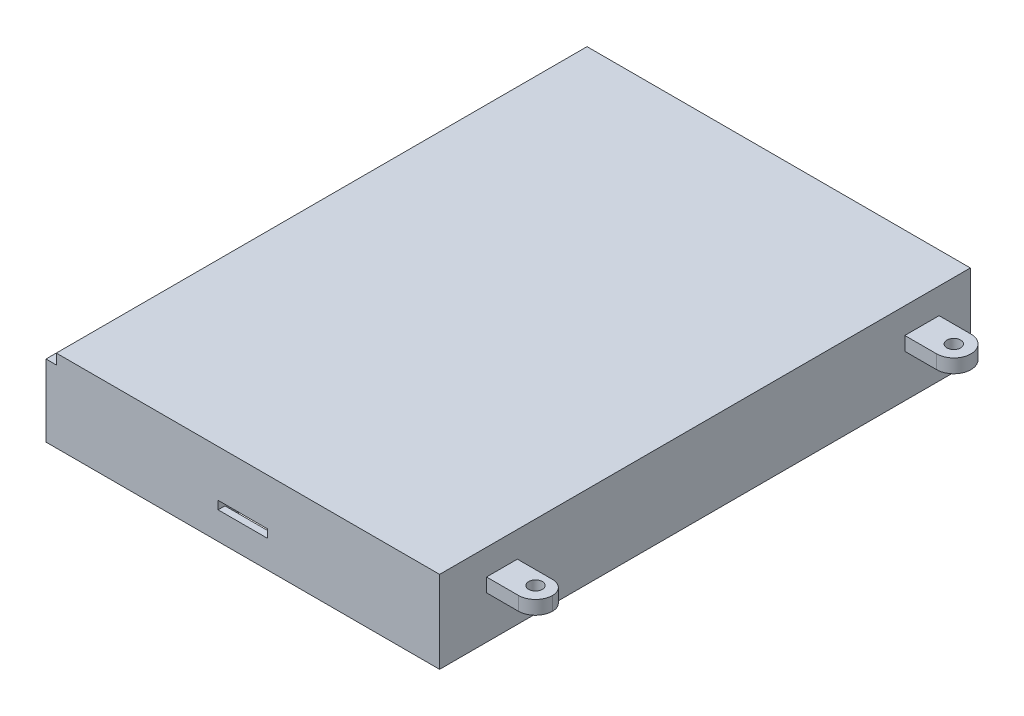
ISO-10303-21;
HEADER;
FILE_DESCRIPTION(('STEP AP214'),'2;1');
FILE_NAME('part.step','',(''),(''),'','','');
FILE_SCHEMA(('AUTOMOTIVE_DESIGN { 1 0 10303 214 1 1 1 1 }'));
ENDSEC;
DATA;
#1=APPLICATION_CONTEXT('core data for automotive mechanical design processes');
#2=APPLICATION_PROTOCOL_DEFINITION('international standard','automotive_design',2000,#1);
#3=PRODUCT_CONTEXT('',#1,'mechanical');
#4=PRODUCT('Part','Part','',(#3));
#5=PRODUCT_RELATED_PRODUCT_CATEGORY('part','',(#4));
#6=PRODUCT_DEFINITION_FORMATION('','',#4);
#7=PRODUCT_DEFINITION_CONTEXT('part definition',#1,'design');
#8=PRODUCT_DEFINITION('design','',#6,#7);
#9=PRODUCT_DEFINITION_SHAPE('','',#8);
#10=(LENGTH_UNIT() NAMED_UNIT(*) SI_UNIT(.MILLI.,.METRE.));
#11=(NAMED_UNIT(*) PLANE_ANGLE_UNIT() SI_UNIT($,.RADIAN.));
#12=(NAMED_UNIT(*) SI_UNIT($,.STERADIAN.) SOLID_ANGLE_UNIT());
#13=UNCERTAINTY_MEASURE_WITH_UNIT(LENGTH_MEASURE(1.E-05),#10,'distance_accuracy_value','');
#14=(GEOMETRIC_REPRESENTATION_CONTEXT(3) GLOBAL_UNCERTAINTY_ASSIGNED_CONTEXT((#13)) GLOBAL_UNIT_ASSIGNED_CONTEXT((#10,
#11,#12)) REPRESENTATION_CONTEXT('',''));
#15=CARTESIAN_POINT('',(0.,0.,0.));
#16=DIRECTION('',(0.,0.,1.));
#17=DIRECTION('',(1.,0.,0.));
#18=AXIS2_PLACEMENT_3D('',#15,#16,#17);
#19=CARTESIAN_POINT('',(26.0779097266843,5.,-34.7));
#20=DIRECTION('',(0.,0.,1.));
#21=DIRECTION('',(1.,0.,0.));
#22=AXIS2_PLACEMENT_3D('',#19,#20,#21);
#23=PLANE('',#22);
#24=DIRECTION('',(0.,1.,0.));
#25=VECTOR('',#24,1.);
#26=CARTESIAN_POINT('',(0.0779097266842485,5.,-34.7));
#27=LINE('',#26,#25);
#28=CARTESIAN_POINT('',(0.0779097266842476,-2.,-34.7));
#29=VERTEX_POINT('',#28);
#30=CARTESIAN_POINT('',(0.0779097266842476,-0.8,-34.7));
#31=VERTEX_POINT('',#30);
#32=EDGE_CURVE('E290',#29,#31,#27,.T.);
#33=ORIENTED_EDGE('',*,*,#32,.T.);
#34=DIRECTION('',(-1.,0.,0.));
#35=VECTOR('',#34,1.);
#36=CARTESIAN_POINT('',(26.0779097266843,-0.8,-34.7));
#37=LINE('',#36,#35);
#38=CARTESIAN_POINT('',(-7.12209027331575,-0.8,-34.7));
#39=VERTEX_POINT('',#38);
#40=EDGE_CURVE('E300',#31,#39,#37,.T.);
#41=ORIENTED_EDGE('',*,*,#40,.T.);
#42=DIRECTION('',(0.,-1.,0.));
#43=VECTOR('',#42,1.);
#44=CARTESIAN_POINT('',(-7.12209027331575,5.,-34.7));
#45=LINE('',#44,#43);
#46=CARTESIAN_POINT('',(-7.12209027331575,-2.,-34.7));
#47=VERTEX_POINT('',#46);
#48=EDGE_CURVE('E287',#39,#47,#45,.T.);
#49=ORIENTED_EDGE('',*,*,#48,.T.);
#50=DIRECTION('',(1.,0.,0.));
#51=VECTOR('',#50,1.);
#52=CARTESIAN_POINT('',(26.0779097266843,-2.,-34.7));
#53=LINE('',#52,#51);
#54=EDGE_CURVE('E297',#47,#29,#53,.T.);
#55=ORIENTED_EDGE('',*,*,#54,.T.);
#56=EDGE_LOOP('',(#33,#41,#49,#55));
#57=FACE_BOUND('',#56,.T.);
#58=DIRECTION('',(-1.,0.,0.));
#59=VECTOR('',#58,1.);
#60=CARTESIAN_POINT('',(0.,4.5,-34.7));
#61=LINE('',#60,#59);
#62=CARTESIAN_POINT('',(-30.7220902733158,4.5,-34.7));
#63=VERTEX_POINT('',#62);
#64=CARTESIAN_POINT('',(-32.2220902733158,4.5,-34.7));
#65=VERTEX_POINT('',#64);
#66=EDGE_CURVE('E342',#63,#65,#61,.T.);
#67=ORIENTED_EDGE('',*,*,#66,.F.);
#68=DIRECTION('',(0.,1.,0.));
#69=VECTOR('',#68,1.);
#70=CARTESIAN_POINT('',(-30.7220902733158,5.,-34.7));
#71=LINE('',#70,#69);
#72=CARTESIAN_POINT('',(-30.7220902733158,6.,-34.7));
#73=VERTEX_POINT('',#72);
#74=EDGE_CURVE('E348',#63,#73,#71,.T.);
#75=ORIENTED_EDGE('',*,*,#74,.T.);
#76=DIRECTION('',(-1.,0.,0.));
#77=VECTOR('',#76,1.);
#78=CARTESIAN_POINT('',(26.0779097266843,6.,-34.7));
#79=LINE('',#78,#77);
#80=CARTESIAN_POINT('',(25.1779097266842,6.,-34.7));
#81=VERTEX_POINT('',#80);
#82=EDGE_CURVE('E364',#81,#73,#79,.T.);
#83=ORIENTED_EDGE('',*,*,#82,.F.);
#84=DIRECTION('',(0.,-1.,0.));
#85=VECTOR('',#84,1.);
#86=CARTESIAN_POINT('',(25.1779097266842,5.,-34.7));
#87=LINE('',#86,#85);
#88=CARTESIAN_POINT('',(25.1779097266842,-6.,-34.7));
#89=VERTEX_POINT('',#88);
#90=EDGE_CURVE('E411',#81,#89,#87,.T.);
#91=ORIENTED_EDGE('',*,*,#90,.T.);
#92=DIRECTION('',(1.,0.,0.));
#93=VECTOR('',#92,1.);
#94=CARTESIAN_POINT('',(26.0779097266843,-6.,-34.7));
#95=LINE('',#94,#93);
#96=CARTESIAN_POINT('',(-32.2220902733158,-6.,-34.7));
#97=VERTEX_POINT('',#96);
#98=EDGE_CURVE('E357',#97,#89,#95,.T.);
#99=ORIENTED_EDGE('',*,*,#98,.F.);
#100=DIRECTION('',(0.,-1.,0.));
#101=VECTOR('',#100,1.);
#102=CARTESIAN_POINT('',(-32.2220902733158,5.,-34.7));
#103=LINE('',#102,#101);
#104=EDGE_CURVE('E487',#65,#97,#103,.T.);
#105=ORIENTED_EDGE('',*,*,#104,.F.);
#106=EDGE_LOOP('',(#67,#75,#83,#91,#99,#105));
#107=FACE_BOUND('',#106,.T.);
#108=ADVANCED_FACE('F45',(#57,#107),#23,.F.);
#109=CARTESIAN_POINT('',(-32.2220902733158,5.,-37.2));
#110=DIRECTION('',(1.,0.,0.));
#111=DIRECTION('',(0.,0.,-1.));
#112=AXIS2_PLACEMENT_3D('',#109,#110,#111);
#113=PLANE('',#112);
#114=DIRECTION('',(0.,-1.,0.));
#115=VECTOR('',#114,1.);
#116=CARTESIAN_POINT('',(-32.2220902733158,5.,42.7));
#117=LINE('',#116,#115);
#118=CARTESIAN_POINT('',(-32.2220902733158,4.5,42.7));
#119=VERTEX_POINT('',#118);
#120=CARTESIAN_POINT('',(-32.2220902733158,-6.,42.7));
#121=VERTEX_POINT('',#120);
#122=EDGE_CURVE('E489',#119,#121,#117,.T.);
#123=ORIENTED_EDGE('',*,*,#122,.F.);
#124=DIRECTION('',(0.,0.,1.));
#125=VECTOR('',#124,1.);
#126=CARTESIAN_POINT('',(-32.2220902733158,4.5,-32.7));
#127=LINE('',#126,#125);
#128=EDGE_CURVE('E336',#65,#119,#127,.T.);
#129=ORIENTED_EDGE('',*,*,#128,.F.);
#130=ORIENTED_EDGE('',*,*,#104,.T.);
#131=DIRECTION('',(0.,0.,-1.));
#132=VECTOR('',#131,1.);
#133=CARTESIAN_POINT('',(-32.2220902733158,-6.,40.7));
#134=LINE('',#133,#132);
#135=EDGE_CURVE('E354',#121,#97,#134,.T.);
#136=ORIENTED_EDGE('',*,*,#135,.F.);
#137=EDGE_LOOP('',(#123,#129,#130,#136));
#138=FACE_BOUND('',#137,.T.);
#139=ADVANCED_FACE('F548',(#138),#113,.F.);
#140=CARTESIAN_POINT('',(-32.3220902733158,5.,42.7));
#141=DIRECTION('',(0.,0.,-1.));
#142=DIRECTION('',(-1.,0.,0.));
#143=AXIS2_PLACEMENT_3D('',#140,#141,#142);
#144=PLANE('',#143);
#145=DIRECTION('',(0.,-1.,0.));
#146=VECTOR('',#145,1.);
#147=CARTESIAN_POINT('',(-7.12209027331575,-0.8,42.7));
#148=LINE('',#147,#146);
#149=CARTESIAN_POINT('',(-7.12209027331575,-0.8,42.7));
#150=VERTEX_POINT('',#149);
#151=CARTESIAN_POINT('',(-7.12209027331575,-2.,42.7));
#152=VERTEX_POINT('',#151);
#153=EDGE_CURVE('E272',#150,#152,#148,.T.);
#154=ORIENTED_EDGE('',*,*,#153,.F.);
#155=DIRECTION('',(-1.,0.,0.));
#156=VECTOR('',#155,1.);
#157=CARTESIAN_POINT('',(0.0779097266842476,-0.8,42.7));
#158=LINE('',#157,#156);
#159=CARTESIAN_POINT('',(0.0779097266842476,-0.8,42.7));
#160=VERTEX_POINT('',#159);
#161=EDGE_CURVE('E276',#160,#150,#158,.T.);
#162=ORIENTED_EDGE('',*,*,#161,.F.);
#163=DIRECTION('',(0.,1.,0.));
#164=VECTOR('',#163,1.);
#165=CARTESIAN_POINT('',(0.0779097266842476,-2.,42.7));
#166=LINE('',#165,#164);
#167=CARTESIAN_POINT('',(0.0779097266842476,-2.,42.7));
#168=VERTEX_POINT('',#167);
#169=EDGE_CURVE('E269',#168,#160,#166,.T.);
#170=ORIENTED_EDGE('',*,*,#169,.F.);
#171=DIRECTION('',(1.,0.,0.));
#172=VECTOR('',#171,1.);
#173=CARTESIAN_POINT('',(-7.12209027331575,-2.,42.7));
#174=LINE('',#173,#172);
#175=EDGE_CURVE('E264',#152,#168,#174,.T.);
#176=ORIENTED_EDGE('',*,*,#175,.F.);
#177=EDGE_LOOP('',(#154,#162,#170,#176));
#178=FACE_BOUND('',#177,.T.);
#179=DIRECTION('',(1.,0.,0.));
#180=VECTOR('',#179,1.);
#181=CARTESIAN_POINT('',(-32.3220902733158,6.,42.7));
#182=LINE('',#181,#180);
#183=CARTESIAN_POINT('',(-30.7220902733157,6.,42.7));
#184=VERTEX_POINT('',#183);
#185=CARTESIAN_POINT('',(25.1779097266842,6.,42.7));
#186=VERTEX_POINT('',#185);
#187=EDGE_CURVE('E365',#184,#186,#182,.T.);
#188=ORIENTED_EDGE('',*,*,#187,.F.);
#189=DIRECTION('',(0.,1.,0.));
#190=VECTOR('',#189,1.);
#191=CARTESIAN_POINT('',(-30.7220902733157,4.5,42.7));
#192=LINE('',#191,#190);
#193=CARTESIAN_POINT('',(-30.7220902733157,4.5,42.7));
#194=VERTEX_POINT('',#193);
#195=EDGE_CURVE('E486',#194,#184,#192,.T.);
#196=ORIENTED_EDGE('',*,*,#195,.F.);
#197=DIRECTION('',(1.,0.,0.));
#198=VECTOR('',#197,1.);
#199=CARTESIAN_POINT('',(0.,4.5,42.7));
#200=LINE('',#199,#198);
#201=EDGE_CURVE('E338',#119,#194,#200,.T.);
#202=ORIENTED_EDGE('',*,*,#201,.F.);
#203=ORIENTED_EDGE('',*,*,#122,.T.);
#204=DIRECTION('',(-1.,0.,0.));
#205=VECTOR('',#204,1.);
#206=CARTESIAN_POINT('',(-32.3220902733158,-6.,42.7));
#207=LINE('',#206,#205);
#208=CARTESIAN_POINT('',(25.1779097266842,-6.,42.7));
#209=VERTEX_POINT('',#208);
#210=EDGE_CURVE('E360',#209,#121,#207,.T.);
#211=ORIENTED_EDGE('',*,*,#210,.F.);
#212=DIRECTION('',(0.,-1.,0.));
#213=VECTOR('',#212,1.);
#214=CARTESIAN_POINT('',(25.1779097266842,5.,42.7));
#215=LINE('',#214,#213);
#216=EDGE_CURVE('E417',#186,#209,#215,.T.);
#217=ORIENTED_EDGE('',*,*,#216,.F.);
#218=EDGE_LOOP('',(#188,#196,#202,#203,#211,#217));
#219=FACE_BOUND('',#218,.T.);
#220=ADVANCED_FACE('F47',(#178,#219),#144,.F.);
#221=CARTESIAN_POINT('',(25.1779097266842,5.,37.2));
#222=DIRECTION('',(-1.,0.,0.));
#223=DIRECTION('',(0.,0.,1.));
#224=AXIS2_PLACEMENT_3D('',#221,#222,#223);
#225=PLANE('',#224);
#226=DIRECTION('',(0.,0.,-1.));
#227=VECTOR('',#226,1.);
#228=CARTESIAN_POINT('',(25.1779097266842,0.25,66.));
#229=LINE('',#228,#227);
#230=CARTESIAN_POINT('',(25.1779097266842,0.25,-25.1415528323985));
#231=VERTEX_POINT('',#230);
#232=CARTESIAN_POINT('',(25.1779097266842,0.25,-30.1415528323985));
#233=VERTEX_POINT('',#232);
#234=EDGE_CURVE('E368',#231,#233,#229,.T.);
#235=ORIENTED_EDGE('',*,*,#234,.F.);
#236=DIRECTION('',(0.,-1.,0.));
#237=VECTOR('',#236,1.);
#238=CARTESIAN_POINT('',(25.1779097266842,5.,-25.1415528323985));
#239=LINE('',#238,#237);
#240=CARTESIAN_POINT('',(25.1779097266842,2.25,-25.1415528323985));
#241=VERTEX_POINT('',#240);
#242=EDGE_CURVE('E382',#241,#231,#239,.T.);
#243=ORIENTED_EDGE('',*,*,#242,.F.);
#244=DIRECTION('',(0.,0.,1.));
#245=VECTOR('',#244,1.);
#246=CARTESIAN_POINT('',(25.1779097266842,2.25,37.2));
#247=LINE('',#246,#245);
#248=CARTESIAN_POINT('',(25.1779097266842,2.25,-30.1415528323985));
#249=VERTEX_POINT('',#248);
#250=EDGE_CURVE('E459',#249,#241,#247,.T.);
#251=ORIENTED_EDGE('',*,*,#250,.F.);
#252=DIRECTION('',(0.,-1.,0.));
#253=VECTOR('',#252,1.);
#254=CARTESIAN_POINT('',(25.1779097266842,5.,-30.1415528323985));
#255=LINE('',#254,#253);
#256=EDGE_CURVE('E379',#249,#233,#255,.T.);
#257=ORIENTED_EDGE('',*,*,#256,.T.);
#258=EDGE_LOOP('',(#235,#243,#251,#257));
#259=FACE_BOUND('',#258,.T.);
#260=DIRECTION('',(0.,1.,0.));
#261=VECTOR('',#260,1.);
#262=CARTESIAN_POINT('',(25.1779097266842,-2.,31.3584471676015));
#263=LINE('',#262,#261);
#264=CARTESIAN_POINT('',(25.1779097266842,0.25,31.3584471676015));
#265=VERTEX_POINT('',#264);
#266=CARTESIAN_POINT('',(25.1779097266842,2.25,31.3584471676015));
#267=VERTEX_POINT('',#266);
#268=EDGE_CURVE('E366',#265,#267,#263,.T.);
#269=ORIENTED_EDGE('',*,*,#268,.F.);
#270=DIRECTION('',(0.,0.,-1.));
#271=VECTOR('',#270,1.);
#272=CARTESIAN_POINT('',(25.1779097266842,0.25,66.));
#273=LINE('',#272,#271);
#274=CARTESIAN_POINT('',(25.1779097266842,0.25,35.8584471676015));
#275=VERTEX_POINT('',#274);
#276=EDGE_CURVE('E445',#275,#265,#273,.T.);
#277=ORIENTED_EDGE('',*,*,#276,.F.);
#278=DIRECTION('',(0.,-1.,0.));
#279=VECTOR('',#278,1.);
#280=CARTESIAN_POINT('',(25.1779097266842,5.,35.8584471676015));
#281=LINE('',#280,#279);
#282=CARTESIAN_POINT('',(25.1779097266842,2.25,35.8584471676015));
#283=VERTEX_POINT('',#282);
#284=EDGE_CURVE('E373',#283,#275,#281,.T.);
#285=ORIENTED_EDGE('',*,*,#284,.F.);
#286=DIRECTION('',(0.,0.,1.));
#287=VECTOR('',#286,1.);
#288=CARTESIAN_POINT('',(25.1779097266842,2.25,37.2));
#289=LINE('',#288,#287);
#290=EDGE_CURVE('E465',#267,#283,#289,.T.);
#291=ORIENTED_EDGE('',*,*,#290,.F.);
#292=EDGE_LOOP('',(#269,#277,#285,#291));
#293=FACE_BOUND('',#292,.T.);
#294=DIRECTION('',(0.,0.,1.));
#295=VECTOR('',#294,1.);
#296=CARTESIAN_POINT('',(25.1779097266842,-6.,40.7));
#297=LINE('',#296,#295);
#298=EDGE_CURVE('E358',#89,#209,#297,.T.);
#299=ORIENTED_EDGE('',*,*,#298,.F.);
#300=ORIENTED_EDGE('',*,*,#90,.F.);
#301=DIRECTION('',(0.,0.,-1.));
#302=VECTOR('',#301,1.);
#303=CARTESIAN_POINT('',(25.1779097266842,6.,-32.7));
#304=LINE('',#303,#302);
#305=EDGE_CURVE('E361',#186,#81,#304,.T.);
#306=ORIENTED_EDGE('',*,*,#305,.F.);
#307=ORIENTED_EDGE('',*,*,#216,.T.);
#308=EDGE_LOOP('',(#299,#300,#306,#307));
#309=FACE_BOUND('',#308,.T.);
#310=ADVANCED_FACE('F576',(#259,#293,#309),#225,.F.);
#311=CARTESIAN_POINT('',(29.8220902733158,5.,-25.1415528323985));
#312=DIRECTION('',(0.,0.,-1.));
#313=DIRECTION('',(-1.,0.,0.));
#314=AXIS2_PLACEMENT_3D('',#311,#312,#313);
#315=PLANE('',#314);
#316=DIRECTION('',(-1.,0.,0.));
#317=VECTOR('',#316,1.);
#318=CARTESIAN_POINT('',(29.8220902733158,0.25,-25.1415528323985));
#319=LINE('',#318,#317);
#320=CARTESIAN_POINT('',(29.8220902733158,0.25,-25.1415528323985));
#321=VERTEX_POINT('',#320);
#322=EDGE_CURVE('E436',#321,#231,#319,.T.);
#323=ORIENTED_EDGE('',*,*,#322,.F.);
#324=DIRECTION('',(0.,-1.,0.));
#325=VECTOR('',#324,1.);
#326=CARTESIAN_POINT('',(29.8220902733158,5.,-25.1415528323985));
#327=LINE('',#326,#325);
#328=CARTESIAN_POINT('',(29.8220902733158,2.25,-25.1415528323985));
#329=VERTEX_POINT('',#328);
#330=EDGE_CURVE('E378',#329,#321,#327,.T.);
#331=ORIENTED_EDGE('',*,*,#330,.F.);
#332=DIRECTION('',(-1.,0.,0.));
#333=VECTOR('',#332,1.);
#334=CARTESIAN_POINT('',(29.8220902733158,2.25,-25.1415528323985));
#335=LINE('',#334,#333);
#336=EDGE_CURVE('E405',#329,#241,#335,.T.);
#337=ORIENTED_EDGE('',*,*,#336,.T.);
#338=ORIENTED_EDGE('',*,*,#242,.T.);
#339=EDGE_LOOP('',(#323,#331,#337,#338));
#340=FACE_BOUND('',#339,.T.);
#341=ADVANCED_FACE('F578',(#340),#315,.F.);
#342=CARTESIAN_POINT('',(29.8220902733158,5.,-27.6415528323985));
#343=DIRECTION('',(0.,-1.,0.));
#344=DIRECTION('',(0.,0.,-1.));
#345=AXIS2_PLACEMENT_3D('',#342,#343,#344);
#346=CYLINDRICAL_SURFACE('',#345,2.5);
#347=CARTESIAN_POINT('',(29.8220902733158,0.25,-27.6415528323985));
#348=DIRECTION('',(0.,-1.,0.));
#349=DIRECTION('',(0.,0.,-1.));
#350=AXIS2_PLACEMENT_3D('',#347,#348,#349);
#351=CIRCLE('',#350,2.5);
#352=CARTESIAN_POINT('',(29.8220902733158,0.25,-30.1415528323985));
#353=VERTEX_POINT('',#352);
#354=EDGE_CURVE('E439',#353,#321,#351,.T.);
#355=ORIENTED_EDGE('',*,*,#354,.F.);
#356=DIRECTION('',(0.,-1.,0.));
#357=VECTOR('',#356,1.);
#358=CARTESIAN_POINT('',(29.8220902733158,5.,-30.1415528323985));
#359=LINE('',#358,#357);
#360=CARTESIAN_POINT('',(29.8220902733158,2.25,-30.1415528323985));
#361=VERTEX_POINT('',#360);
#362=EDGE_CURVE('E375',#361,#353,#359,.T.);
#363=ORIENTED_EDGE('',*,*,#362,.F.);
#364=CARTESIAN_POINT('',(29.8220902733158,2.25,-27.6415528323985));
#365=DIRECTION('',(0.,-1.,0.));
#366=DIRECTION('',(0.,0.,-1.));
#367=AXIS2_PLACEMENT_3D('',#364,#365,#366);
#368=CIRCLE('',#367,2.5);
#369=EDGE_CURVE('E472',#361,#329,#368,.T.);
#370=ORIENTED_EDGE('',*,*,#369,.T.);
#371=ORIENTED_EDGE('',*,*,#330,.T.);
#372=EDGE_LOOP('',(#355,#363,#370,#371));
#373=FACE_BOUND('',#372,.T.);
#374=ADVANCED_FACE('F598',(#373),#346,.T.);
#375=CARTESIAN_POINT('',(29.8220902733158,5.,-30.1415528323985));
#376=DIRECTION('',(0.,0.,1.));
#377=DIRECTION('',(1.,0.,0.));
#378=AXIS2_PLACEMENT_3D('',#375,#376,#377);
#379=PLANE('',#378);
#380=DIRECTION('',(1.,0.,0.));
#381=VECTOR('',#380,1.);
#382=CARTESIAN_POINT('',(29.8220902733158,0.25,-30.1415528323985));
#383=LINE('',#382,#381);
#384=EDGE_CURVE('E441',#233,#353,#383,.T.);
#385=ORIENTED_EDGE('',*,*,#384,.F.);
#386=ORIENTED_EDGE('',*,*,#256,.F.);
#387=DIRECTION('',(1.,0.,0.));
#388=VECTOR('',#387,1.);
#389=CARTESIAN_POINT('',(29.8220902733158,2.25,-30.1415528323985));
#390=LINE('',#389,#388);
#391=EDGE_CURVE('E462',#249,#361,#390,.T.);
#392=ORIENTED_EDGE('',*,*,#391,.T.);
#393=ORIENTED_EDGE('',*,*,#362,.T.);
#394=EDGE_LOOP('',(#385,#386,#392,#393));
#395=FACE_BOUND('',#394,.T.);
#396=ADVANCED_FACE('F602',(#395),#379,.F.);
#397=CARTESIAN_POINT('',(29.8220902733158,5.,35.8584471676015));
#398=DIRECTION('',(0.,0.,-1.));
#399=DIRECTION('',(-1.,0.,0.));
#400=AXIS2_PLACEMENT_3D('',#397,#398,#399);
#401=PLANE('',#400);
#402=DIRECTION('',(-1.,0.,0.));
#403=VECTOR('',#402,1.);
#404=CARTESIAN_POINT('',(29.8220902733158,0.25,35.8584471676015));
#405=LINE('',#404,#403);
#406=CARTESIAN_POINT('',(29.8220902733158,0.25,35.8584471676015));
#407=VERTEX_POINT('',#406);
#408=EDGE_CURVE('E443',#407,#275,#405,.T.);
#409=ORIENTED_EDGE('',*,*,#408,.F.);
#410=DIRECTION('',(0.,-1.,0.));
#411=VECTOR('',#410,1.);
#412=CARTESIAN_POINT('',(29.8220902733158,5.,35.8584471676015));
#413=LINE('',#412,#411);
#414=CARTESIAN_POINT('',(29.8220902733158,2.25,35.8584471676015));
#415=VERTEX_POINT('',#414);
#416=EDGE_CURVE('E370',#415,#407,#413,.T.);
#417=ORIENTED_EDGE('',*,*,#416,.F.);
#418=DIRECTION('',(1.,0.,0.));
#419=VECTOR('',#418,1.);
#420=CARTESIAN_POINT('',(26.0779097266843,2.25,35.8584471676015));
#421=LINE('',#420,#419);
#422=EDGE_CURVE('E438',#283,#415,#421,.T.);
#423=ORIENTED_EDGE('',*,*,#422,.F.);
#424=ORIENTED_EDGE('',*,*,#284,.T.);
#425=EDGE_LOOP('',(#409,#417,#423,#424));
#426=FACE_BOUND('',#425,.T.);
#427=ADVANCED_FACE('F606',(#426),#401,.F.);
#428=CARTESIAN_POINT('',(29.8220902733158,5.,33.3584471676015));
#429=DIRECTION('',(0.,-1.,0.));
#430=DIRECTION('',(0.,0.,-1.));
#431=AXIS2_PLACEMENT_3D('',#428,#429,#430);
#432=CYLINDRICAL_SURFACE('',#431,2.5);
#433=CARTESIAN_POINT('',(29.8220902733158,0.25,33.3584471676015));
#434=DIRECTION('',(0.,-1.,0.));
#435=DIRECTION('',(0.,0.,-1.));
#436=AXIS2_PLACEMENT_3D('',#433,#434,#435);
#437=CIRCLE('',#436,2.5);
#438=CARTESIAN_POINT('',(32.3220902733158,0.25,33.3584471676015));
#439=VERTEX_POINT('',#438);
#440=EDGE_CURVE('E434',#439,#407,#437,.T.);
#441=ORIENTED_EDGE('',*,*,#440,.F.);
#442=DIRECTION('',(0.,-1.,0.));
#443=VECTOR('',#442,1.);
#444=CARTESIAN_POINT('',(32.3220902733158,5.,33.3584471676015));
#445=LINE('',#444,#443);
#446=CARTESIAN_POINT('',(32.3220902733158,2.25,33.3584471676015));
#447=VERTEX_POINT('',#446);
#448=EDGE_CURVE('E418',#439,#447,#445,.F.);
#449=ORIENTED_EDGE('',*,*,#448,.T.);
#450=CARTESIAN_POINT('',(29.8220902733158,2.25,33.3584471676015));
#451=DIRECTION('',(0.,-1.,0.));
#452=DIRECTION('',(0.,0.,-1.));
#453=AXIS2_PLACEMENT_3D('',#450,#451,#452);
#454=CIRCLE('',#453,2.5);
#455=EDGE_CURVE('E460',#447,#415,#454,.T.);
#456=ORIENTED_EDGE('',*,*,#455,.T.);
#457=ORIENTED_EDGE('',*,*,#416,.T.);
#458=EDGE_LOOP('',(#441,#449,#456,#457));
#459=FACE_BOUND('',#458,.T.);
#460=ADVANCED_FACE('F610',(#459),#432,.T.);
#461=CARTESIAN_POINT('',(29.8220902733158,5.,-27.6415528323985));
#462=DIRECTION('',(0.,-1.,0.));
#463=DIRECTION('',(0.,0.,-1.));
#464=AXIS2_PLACEMENT_3D('',#461,#462,#463);
#465=CYLINDRICAL_SURFACE('',#464,0.999999999999997);
#466=CARTESIAN_POINT('',(29.8220902733158,2.25,-27.6415528323985));
#467=DIRECTION('',(0.,-1.,0.));
#468=DIRECTION('',(0.,0.,-1.));
#469=AXIS2_PLACEMENT_3D('',#466,#467,#468);
#470=CIRCLE('',#469,0.999999999999997);
#471=CARTESIAN_POINT('',(29.8220902733158,2.25,-28.6415528323985));
#472=VERTEX_POINT('',#471);
#473=EDGE_CURVE('E458',#472,#472,#470,.T.);
#474=ORIENTED_EDGE('',*,*,#473,.F.);
#475=EDGE_LOOP('',(#474));
#476=FACE_BOUND('',#475,.T.);
#477=CARTESIAN_POINT('',(29.8220902733158,0.25,-27.6415528323985));
#478=DIRECTION('',(0.,-1.,0.));
#479=DIRECTION('',(0.,0.,-1.));
#480=AXIS2_PLACEMENT_3D('',#477,#478,#479);
#481=CIRCLE('',#480,0.999999999999997);
#482=CARTESIAN_POINT('',(29.8220902733158,0.25,-28.6415528323985));
#483=VERTEX_POINT('',#482);
#484=EDGE_CURVE('E431',#483,#483,#481,.T.);
#485=ORIENTED_EDGE('',*,*,#484,.T.);
#486=EDGE_LOOP('',(#485));
#487=FACE_BOUND('',#486,.T.);
#488=ADVANCED_FACE('F614',(#476,#487),#465,.F.);
#489=CARTESIAN_POINT('',(29.8220902733158,5.,33.3584471676015));
#490=DIRECTION('',(0.,-1.,0.));
#491=DIRECTION('',(0.,0.,-1.));
#492=AXIS2_PLACEMENT_3D('',#489,#490,#491);
#493=CYLINDRICAL_SURFACE('',#492,0.999999999999998);
#494=CARTESIAN_POINT('',(29.8220902733158,2.25,33.3584471676015));
#495=DIRECTION('',(0.,-1.,0.));
#496=DIRECTION('',(0.,0.,-1.));
#497=AXIS2_PLACEMENT_3D('',#494,#495,#496);
#498=CIRCLE('',#497,0.999999999999998);
#499=CARTESIAN_POINT('',(29.8220902733158,2.25,32.3584471676015));
#500=VERTEX_POINT('',#499);
#501=EDGE_CURVE('E455',#500,#500,#498,.T.);
#502=ORIENTED_EDGE('',*,*,#501,.F.);
#503=EDGE_LOOP('',(#502));
#504=FACE_BOUND('',#503,.T.);
#505=CARTESIAN_POINT('',(29.8220902733158,0.25,33.3584471676015));
#506=DIRECTION('',(0.,-1.,0.));
#507=DIRECTION('',(0.,0.,-1.));
#508=AXIS2_PLACEMENT_3D('',#505,#506,#507);
#509=CIRCLE('',#508,0.999999999999998);
#510=CARTESIAN_POINT('',(29.8220902733158,0.25,32.3584471676015));
#511=VERTEX_POINT('',#510);
#512=EDGE_CURVE('E435',#511,#511,#509,.T.);
#513=ORIENTED_EDGE('',*,*,#512,.T.);
#514=EDGE_LOOP('',(#513));
#515=FACE_BOUND('',#514,.T.);
#516=ADVANCED_FACE('F563',(#504,#515),#493,.F.);
#517=CARTESIAN_POINT('',(26.0779097266843,2.25,-69.6415528323985));
#518=DIRECTION('',(0.,-1.,0.));
#519=DIRECTION('',(0.,0.,-1.));
#520=AXIS2_PLACEMENT_3D('',#517,#518,#519);
#521=PLANE('',#520);
#522=ORIENTED_EDGE('',*,*,#501,.T.);
#523=EDGE_LOOP('',(#522));
#524=FACE_BOUND('',#523,.T.);
#525=ORIENTED_EDGE('',*,*,#455,.F.);
#526=CARTESIAN_POINT('',(30.3220902733158,2.25,33.3584471676015));
#527=DIRECTION('',(0.,-1.,0.));
#528=DIRECTION('',(0.,0.,-1.));
#529=AXIS2_PLACEMENT_3D('',#526,#527,#528);
#530=CIRCLE('',#529,2.);
#531=CARTESIAN_POINT('',(30.3220902733158,2.25,31.3584471676015));
#532=VERTEX_POINT('',#531);
#533=EDGE_CURVE('E421',#447,#532,#530,.F.);
#534=ORIENTED_EDGE('',*,*,#533,.T.);
#535=DIRECTION('',(1.,0.,0.));
#536=VECTOR('',#535,1.);
#537=CARTESIAN_POINT('',(25.1779097266842,2.25,31.3584471676015));
#538=LINE('',#537,#536);
#539=EDGE_CURVE('E369',#267,#532,#538,.T.);
#540=ORIENTED_EDGE('',*,*,#539,.F.);
#541=ORIENTED_EDGE('',*,*,#290,.T.);
#542=ORIENTED_EDGE('',*,*,#422,.T.);
#543=EDGE_LOOP('',(#525,#534,#540,#541,#542));
#544=FACE_BOUND('',#543,.T.);
#545=ADVANCED_FACE('F559',(#524,#544),#521,.F.);
#546=ORIENTED_EDGE('',*,*,#473,.T.);
#547=EDGE_LOOP('',(#546));
#548=FACE_BOUND('',#547,.T.);
#549=ORIENTED_EDGE('',*,*,#369,.F.);
#550=ORIENTED_EDGE('',*,*,#391,.F.);
#551=ORIENTED_EDGE('',*,*,#250,.T.);
#552=ORIENTED_EDGE('',*,*,#336,.F.);
#553=EDGE_LOOP('',(#549,#550,#551,#552));
#554=FACE_BOUND('',#553,.T.);
#555=ADVANCED_FACE('F562',(#548,#554),#521,.F.);
#556=CARTESIAN_POINT('',(25.1779097266842,0.25,66.));
#557=DIRECTION('',(0.,-1.,0.));
#558=DIRECTION('',(0.,0.,-1.));
#559=AXIS2_PLACEMENT_3D('',#556,#557,#558);
#560=PLANE('',#559);
#561=DIRECTION('',(-1.,0.,0.));
#562=VECTOR('',#561,1.);
#563=CARTESIAN_POINT('',(25.1779097266842,0.25,31.3584471676015));
#564=LINE('',#563,#562);
#565=CARTESIAN_POINT('',(30.3220902733158,0.25,31.3584471676015));
#566=VERTEX_POINT('',#565);
#567=EDGE_CURVE('E414',#566,#265,#564,.T.);
#568=ORIENTED_EDGE('',*,*,#567,.F.);
#569=CARTESIAN_POINT('',(30.3220902733158,0.25,33.3584471676015));
#570=DIRECTION('',(0.,-1.,0.));
#571=DIRECTION('',(0.,0.,-1.));
#572=AXIS2_PLACEMENT_3D('',#569,#570,#571);
#573=CIRCLE('',#572,2.);
#574=EDGE_CURVE('E424',#566,#439,#573,.T.);
#575=ORIENTED_EDGE('',*,*,#574,.T.);
#576=ORIENTED_EDGE('',*,*,#440,.T.);
#577=ORIENTED_EDGE('',*,*,#408,.T.);
#578=ORIENTED_EDGE('',*,*,#276,.T.);
#579=EDGE_LOOP('',(#568,#575,#576,#577,#578));
#580=FACE_BOUND('',#579,.T.);
#581=ORIENTED_EDGE('',*,*,#512,.F.);
#582=EDGE_LOOP('',(#581));
#583=FACE_BOUND('',#582,.T.);
#584=ADVANCED_FACE('F569',(#580,#583),#560,.T.);
#585=ORIENTED_EDGE('',*,*,#484,.F.);
#586=EDGE_LOOP('',(#585));
#587=FACE_BOUND('',#586,.T.);
#588=ORIENTED_EDGE('',*,*,#322,.T.);
#589=ORIENTED_EDGE('',*,*,#234,.T.);
#590=ORIENTED_EDGE('',*,*,#384,.T.);
#591=ORIENTED_EDGE('',*,*,#354,.T.);
#592=EDGE_LOOP('',(#588,#589,#590,#591));
#593=FACE_BOUND('',#592,.T.);
#594=ADVANCED_FACE('F565',(#587,#593),#560,.T.);
#595=CARTESIAN_POINT('',(25.1779097266842,-2.,31.3584471676015));
#596=DIRECTION('',(0.,0.,1.));
#597=DIRECTION('',(1.,0.,0.));
#598=AXIS2_PLACEMENT_3D('',#595,#596,#597);
#599=PLANE('',#598);
#600=ORIENTED_EDGE('',*,*,#539,.T.);
#601=DIRECTION('',(0.,-1.,0.));
#602=VECTOR('',#601,1.);
#603=CARTESIAN_POINT('',(30.3220902733158,-2.,31.3584471676015));
#604=LINE('',#603,#602);
#605=EDGE_CURVE('E422',#532,#566,#604,.T.);
#606=ORIENTED_EDGE('',*,*,#605,.T.);
#607=ORIENTED_EDGE('',*,*,#567,.T.);
#608=ORIENTED_EDGE('',*,*,#268,.T.);
#609=EDGE_LOOP('',(#600,#606,#607,#608));
#610=FACE_BOUND('',#609,.T.);
#611=ADVANCED_FACE('F568',(#610),#599,.F.);
#612=CARTESIAN_POINT('',(30.3220902733158,5.,33.3584471676015));
#613=DIRECTION('',(0.,-1.,0.));
#614=DIRECTION('',(0.,0.,-1.));
#615=AXIS2_PLACEMENT_3D('',#612,#613,#614);
#616=CYLINDRICAL_SURFACE('',#615,2.);
#617=ORIENTED_EDGE('',*,*,#574,.F.);
#618=ORIENTED_EDGE('',*,*,#605,.F.);
#619=ORIENTED_EDGE('',*,*,#533,.F.);
#620=ORIENTED_EDGE('',*,*,#448,.F.);
#621=EDGE_LOOP('',(#617,#618,#619,#620));
#622=FACE_BOUND('',#621,.T.);
#623=ADVANCED_FACE('F571',(#622),#616,.T.);
#624=CARTESIAN_POINT('',(0.,6.,0.));
#625=DIRECTION('',(0.,1.,0.));
#626=DIRECTION('',(0.,0.,1.));
#627=AXIS2_PLACEMENT_3D('',#624,#625,#626);
#628=PLANE('',#627);
#629=DIRECTION('',(0.,0.,-1.));
#630=VECTOR('',#629,1.);
#631=CARTESIAN_POINT('',(-30.7220902733158,6.,-32.7));
#632=LINE('',#631,#630);
#633=EDGE_CURVE('E319',#184,#73,#632,.T.);
#634=ORIENTED_EDGE('',*,*,#633,.F.);
#635=ORIENTED_EDGE('',*,*,#187,.T.);
#636=ORIENTED_EDGE('',*,*,#305,.T.);
#637=ORIENTED_EDGE('',*,*,#82,.T.);
#638=EDGE_LOOP('',(#634,#635,#636,#637));
#639=FACE_BOUND('',#638,.T.);
#640=ADVANCED_FACE('F574',(#639),#628,.T.);
#641=CARTESIAN_POINT('',(0.,-6.,0.));
#642=DIRECTION('',(0.,-1.,0.));
#643=DIRECTION('',(0.,0.,-1.));
#644=AXIS2_PLACEMENT_3D('',#641,#642,#643);
#645=PLANE('',#644);
#646=DIRECTION('',(0.,0.,1.));
#647=VECTOR('',#646,1.);
#648=CARTESIAN_POINT('',(0.0779097266842476,-6.,41.7));
#649=LINE('',#648,#647);
#650=CARTESIAN_POINT('',(0.0779097266842476,-6.,39.7));
#651=VERTEX_POINT('',#650);
#652=CARTESIAN_POINT('',(0.0779097266842476,-6.,41.7));
#653=VERTEX_POINT('',#652);
#654=EDGE_CURVE('E311',#651,#653,#649,.T.);
#655=ORIENTED_EDGE('',*,*,#654,.F.);
#656=DIRECTION('',(1.,0.,0.));
#657=VECTOR('',#656,1.);
#658=CARTESIAN_POINT('',(-30.8220902733158,-6.,39.7));
#659=LINE('',#658,#657);
#660=CARTESIAN_POINT('',(24.1779097266843,-6.,39.7));
#661=VERTEX_POINT('',#660);
#662=EDGE_CURVE('E392',#651,#661,#659,.T.);
#663=ORIENTED_EDGE('',*,*,#662,.T.);
#664=DIRECTION('',(0.,0.,-1.));
#665=VECTOR('',#664,1.);
#666=CARTESIAN_POINT('',(24.1779097266842,-6.,35.7));
#667=LINE('',#666,#665);
#668=CARTESIAN_POINT('',(24.1779097266842,-6.,-31.7));
#669=VERTEX_POINT('',#668);
#670=EDGE_CURVE('E391',#661,#669,#667,.T.);
#671=ORIENTED_EDGE('',*,*,#670,.T.);
#672=DIRECTION('',(-1.,0.,0.));
#673=VECTOR('',#672,1.);
#674=CARTESIAN_POINT('',(24.5779097266843,-6.,-31.7));
#675=LINE('',#674,#673);
#676=CARTESIAN_POINT('',(0.0779097266842476,-6.,-31.7));
#677=VERTEX_POINT('',#676);
#678=EDGE_CURVE('E383',#669,#677,#675,.T.);
#679=ORIENTED_EDGE('',*,*,#678,.T.);
#680=DIRECTION('',(0.,0.,1.));
#681=VECTOR('',#680,1.);
#682=CARTESIAN_POINT('',(0.0779097266842476,-6.,-33.7));
#683=LINE('',#682,#681);
#684=CARTESIAN_POINT('',(0.0779097266842476,-6.,-33.7));
#685=VERTEX_POINT('',#684);
#686=EDGE_CURVE('E324',#685,#677,#683,.T.);
#687=ORIENTED_EDGE('',*,*,#686,.F.);
#688=DIRECTION('',(1.,0.,0.));
#689=VECTOR('',#688,1.);
#690=CARTESIAN_POINT('',(-3.52209027331575,-6.,-33.7));
#691=LINE('',#690,#689);
#692=CARTESIAN_POINT('',(-7.12209027331575,-6.,-33.7));
#693=VERTEX_POINT('',#692);
#694=EDGE_CURVE('E330',#693,#685,#691,.T.);
#695=ORIENTED_EDGE('',*,*,#694,.F.);
#696=DIRECTION('',(0.,0.,-1.));
#697=VECTOR('',#696,1.);
#698=CARTESIAN_POINT('',(-7.12209027331575,-6.,-30.9202718179918));
#699=LINE('',#698,#697);
#700=CARTESIAN_POINT('',(-7.12209027331575,-6.,-31.7));
#701=VERTEX_POINT('',#700);
#702=EDGE_CURVE('E303',#701,#693,#699,.T.);
#703=ORIENTED_EDGE('',*,*,#702,.F.);
#704=CARTESIAN_POINT('',(-31.2220902733158,-6.,-31.7));
#705=VERTEX_POINT('',#704);
#706=EDGE_CURVE('E387',#701,#705,#675,.T.);
#707=ORIENTED_EDGE('',*,*,#706,.T.);
#708=DIRECTION('',(0.,0.,1.));
#709=VECTOR('',#708,1.);
#710=CARTESIAN_POINT('',(-31.2220902733158,-6.,-35.7));
#711=LINE('',#710,#709);
#712=CARTESIAN_POINT('',(-31.2220902733158,-6.,39.7));
#713=VERTEX_POINT('',#712);
#714=EDGE_CURVE('E402',#705,#713,#711,.T.);
#715=ORIENTED_EDGE('',*,*,#714,.T.);
#716=CARTESIAN_POINT('',(-7.12209027331575,-6.,39.7));
#717=VERTEX_POINT('',#716);
#718=EDGE_CURVE('E388',#713,#717,#659,.T.);
#719=ORIENTED_EDGE('',*,*,#718,.T.);
#720=DIRECTION('',(0.,0.,-1.));
#721=VECTOR('',#720,1.);
#722=CARTESIAN_POINT('',(-7.12209027331575,-6.,38.9202718179918));
#723=LINE('',#722,#721);
#724=CARTESIAN_POINT('',(-7.12209027331575,-6.,41.7));
#725=VERTEX_POINT('',#724);
#726=EDGE_CURVE('E309',#725,#717,#723,.T.);
#727=ORIENTED_EDGE('',*,*,#726,.F.);
#728=DIRECTION('',(-1.,0.,0.));
#729=VECTOR('',#728,1.);
#730=CARTESIAN_POINT('',(-3.52209027331575,-6.,41.7));
#731=LINE('',#730,#729);
#732=EDGE_CURVE('E306',#653,#725,#731,.T.);
#733=ORIENTED_EDGE('',*,*,#732,.F.);
#734=EDGE_LOOP('',(#655,#663,#671,#679,#687,#695,#703,#707,#715,#719,#727,#733));
#735=FACE_BOUND('',#734,.T.);
#736=ORIENTED_EDGE('',*,*,#135,.T.);
#737=ORIENTED_EDGE('',*,*,#98,.T.);
#738=ORIENTED_EDGE('',*,*,#298,.T.);
#739=ORIENTED_EDGE('',*,*,#210,.T.);
#740=EDGE_LOOP('',(#736,#737,#738,#739));
#741=FACE_BOUND('',#740,.T.);
#742=ADVANCED_FACE('F530',(#735,#741),#645,.T.);
#743=CARTESIAN_POINT('',(-30.8220902733158,5.,39.7));
#744=DIRECTION('',(0.,0.,-1.));
#745=DIRECTION('',(-1.,0.,0.));
#746=AXIS2_PLACEMENT_3D('',#743,#744,#745);
#747=PLANE('',#746);
#748=DIRECTION('',(0.,-1.,0.));
#749=VECTOR('',#748,1.);
#750=CARTESIAN_POINT('',(0.0779097266842485,5.,39.7));
#751=LINE('',#750,#749);
#752=CARTESIAN_POINT('',(0.0779097266842476,-0.8,39.7));
#753=VERTEX_POINT('',#752);
#754=EDGE_CURVE('E12',#753,#651,#751,.T.);
#755=ORIENTED_EDGE('',*,*,#754,.F.);
#756=DIRECTION('',(1.,0.,0.));
#757=VECTOR('',#756,1.);
#758=CARTESIAN_POINT('',(-30.8220902733158,-0.8,39.7));
#759=LINE('',#758,#757);
#760=CARTESIAN_POINT('',(-7.12209027331575,-0.8,39.7));
#761=VERTEX_POINT('',#760);
#762=EDGE_CURVE('E512',#761,#753,#759,.T.);
#763=ORIENTED_EDGE('',*,*,#762,.F.);
#764=DIRECTION('',(0.,1.,0.));
#765=VECTOR('',#764,1.);
#766=CARTESIAN_POINT('',(-7.12209027331575,5.,39.7));
#767=LINE('',#766,#765);
#768=EDGE_CURVE('E53',#717,#761,#767,.T.);
#769=ORIENTED_EDGE('',*,*,#768,.F.);
#770=ORIENTED_EDGE('',*,*,#718,.F.);
#771=DIRECTION('',(0.,-1.,0.));
#772=VECTOR('',#771,1.);
#773=CARTESIAN_POINT('',(-31.2220902733158,5.,39.7));
#774=LINE('',#773,#772);
#775=CARTESIAN_POINT('',(-31.2220902733158,4.5,39.7));
#776=VERTEX_POINT('',#775);
#777=EDGE_CURVE('E401',#776,#713,#774,.T.);
#778=ORIENTED_EDGE('',*,*,#777,.F.);
#779=DIRECTION('',(-1.,0.,0.));
#780=VECTOR('',#779,1.);
#781=CARTESIAN_POINT('',(-30.8220902733158,4.5,39.7));
#782=LINE('',#781,#780);
#783=CARTESIAN_POINT('',(-30.7220902733157,4.5,39.7));
#784=VERTEX_POINT('',#783);
#785=EDGE_CURVE('E352',#784,#776,#782,.T.);
#786=ORIENTED_EDGE('',*,*,#785,.F.);
#787=DIRECTION('',(0.,-1.,0.));
#788=VECTOR('',#787,1.);
#789=CARTESIAN_POINT('',(-30.7220902733157,5.,39.7));
#790=LINE('',#789,#788);
#791=CARTESIAN_POINT('',(-30.7220902733157,5.5,39.7));
#792=VERTEX_POINT('',#791);
#793=EDGE_CURVE('E347',#792,#784,#790,.T.);
#794=ORIENTED_EDGE('',*,*,#793,.F.);
#795=DIRECTION('',(1.,0.,0.));
#796=VECTOR('',#795,1.);
#797=CARTESIAN_POINT('',(-30.8220902733158,5.5,39.7));
#798=LINE('',#797,#796);
#799=CARTESIAN_POINT('',(24.1779097266842,5.5,39.7));
#800=VERTEX_POINT('',#799);
#801=EDGE_CURVE('E425',#792,#800,#798,.T.);
#802=ORIENTED_EDGE('',*,*,#801,.T.);
#803=DIRECTION('',(0.,-1.,0.));
#804=VECTOR('',#803,1.);
#805=CARTESIAN_POINT('',(24.1779097266842,5.,39.7));
#806=LINE('',#805,#804);
#807=EDGE_CURVE('E397',#800,#661,#806,.T.);
#808=ORIENTED_EDGE('',*,*,#807,.T.);
#809=ORIENTED_EDGE('',*,*,#662,.F.);
#810=EDGE_LOOP('',(#755,#763,#769,#770,#778,#786,#794,#802,#808,#809));
#811=FACE_BOUND('',#810,.T.);
#812=ADVANCED_FACE('F522',(#811),#747,.T.);
#813=CARTESIAN_POINT('',(24.1779097266842,5.,35.7));
#814=DIRECTION('',(-1.,0.,0.));
#815=DIRECTION('',(0.,0.,1.));
#816=AXIS2_PLACEMENT_3D('',#813,#814,#815);
#817=PLANE('',#816);
#818=ORIENTED_EDGE('',*,*,#670,.F.);
#819=ORIENTED_EDGE('',*,*,#807,.F.);
#820=DIRECTION('',(0.,0.,-1.));
#821=VECTOR('',#820,1.);
#822=CARTESIAN_POINT('',(24.1779097266842,5.5,35.7));
#823=LINE('',#822,#821);
#824=CARTESIAN_POINT('',(24.1779097266842,5.5,-31.7));
#825=VERTEX_POINT('',#824);
#826=EDGE_CURVE('E398',#800,#825,#823,.T.);
#827=ORIENTED_EDGE('',*,*,#826,.T.);
#828=DIRECTION('',(0.,-1.,0.));
#829=VECTOR('',#828,1.);
#830=CARTESIAN_POINT('',(24.1779097266842,5.,-31.7));
#831=LINE('',#830,#829);
#832=EDGE_CURVE('E394',#825,#669,#831,.T.);
#833=ORIENTED_EDGE('',*,*,#832,.T.);
#834=EDGE_LOOP('',(#818,#819,#827,#833));
#835=FACE_BOUND('',#834,.T.);
#836=ADVANCED_FACE('F587',(#835),#817,.T.);
#837=CARTESIAN_POINT('',(24.5779097266843,5.,-31.7));
#838=DIRECTION('',(0.,0.,1.));
#839=DIRECTION('',(1.,0.,0.));
#840=AXIS2_PLACEMENT_3D('',#837,#838,#839);
#841=PLANE('',#840);
#842=DIRECTION('',(0.,-1.,0.));
#843=VECTOR('',#842,1.);
#844=CARTESIAN_POINT('',(-7.12209027331575,5.,-31.7));
#845=LINE('',#844,#843);
#846=CARTESIAN_POINT('',(-7.12209027331575,-0.8,-31.7));
#847=VERTEX_POINT('',#846);
#848=EDGE_CURVE('E510',#847,#701,#845,.T.);
#849=ORIENTED_EDGE('',*,*,#848,.F.);
#850=DIRECTION('',(1.,0.,0.));
#851=VECTOR('',#850,1.);
#852=CARTESIAN_POINT('',(24.5779097266843,-0.8,-31.7));
#853=LINE('',#852,#851);
#854=CARTESIAN_POINT('',(0.077909726684245,-0.8,-31.7));
#855=VERTEX_POINT('',#854);
#856=EDGE_CURVE('E484',#847,#855,#853,.T.);
#857=ORIENTED_EDGE('',*,*,#856,.T.);
#858=DIRECTION('',(0.,1.,0.));
#859=VECTOR('',#858,1.);
#860=CARTESIAN_POINT('',(0.0779097266842485,5.,-31.7));
#861=LINE('',#860,#859);
#862=EDGE_CURVE('E508',#677,#855,#861,.T.);
#863=ORIENTED_EDGE('',*,*,#862,.F.);
#864=ORIENTED_EDGE('',*,*,#678,.F.);
#865=ORIENTED_EDGE('',*,*,#832,.F.);
#866=DIRECTION('',(-1.,0.,0.));
#867=VECTOR('',#866,1.);
#868=CARTESIAN_POINT('',(24.5779097266843,5.5,-31.7));
#869=LINE('',#868,#867);
#870=CARTESIAN_POINT('',(-30.7220902733157,5.5,-31.7));
#871=VERTEX_POINT('',#870);
#872=EDGE_CURVE('E386',#825,#871,#869,.T.);
#873=ORIENTED_EDGE('',*,*,#872,.T.);
#874=DIRECTION('',(0.,1.,0.));
#875=VECTOR('',#874,1.);
#876=CARTESIAN_POINT('',(-30.7220902733158,5.,-31.7));
#877=LINE('',#876,#875);
#878=CARTESIAN_POINT('',(-30.7220902733158,4.5,-31.7));
#879=VERTEX_POINT('',#878);
#880=EDGE_CURVE('E345',#879,#871,#877,.T.);
#881=ORIENTED_EDGE('',*,*,#880,.F.);
#882=DIRECTION('',(1.,0.,0.));
#883=VECTOR('',#882,1.);
#884=CARTESIAN_POINT('',(24.5779097266843,4.5,-31.7));
#885=LINE('',#884,#883);
#886=CARTESIAN_POINT('',(-31.2220902733158,4.5,-31.7));
#887=VERTEX_POINT('',#886);
#888=EDGE_CURVE('E350',#887,#879,#885,.T.);
#889=ORIENTED_EDGE('',*,*,#888,.F.);
#890=DIRECTION('',(0.,-1.,0.));
#891=VECTOR('',#890,1.);
#892=CARTESIAN_POINT('',(-31.2220902733158,5.,-31.7));
#893=LINE('',#892,#891);
#894=EDGE_CURVE('E374',#887,#705,#893,.T.);
#895=ORIENTED_EDGE('',*,*,#894,.T.);
#896=ORIENTED_EDGE('',*,*,#706,.F.);
#897=EDGE_LOOP('',(#849,#857,#863,#864,#865,#873,#881,#889,#895,#896));
#898=FACE_BOUND('',#897,.T.);
#899=ADVANCED_FACE('F585',(#898),#841,.T.);
#900=CARTESIAN_POINT('',(-31.2220902733158,5.,-35.7));
#901=DIRECTION('',(1.,0.,0.));
#902=DIRECTION('',(0.,0.,-1.));
#903=AXIS2_PLACEMENT_3D('',#900,#901,#902);
#904=PLANE('',#903);
#905=DIRECTION('',(0.,0.,-1.));
#906=VECTOR('',#905,1.);
#907=CARTESIAN_POINT('',(-31.2220902733158,4.5,-35.7));
#908=LINE('',#907,#906);
#909=EDGE_CURVE('E482',#776,#887,#908,.T.);
#910=ORIENTED_EDGE('',*,*,#909,.F.);
#911=ORIENTED_EDGE('',*,*,#777,.T.);
#912=ORIENTED_EDGE('',*,*,#714,.F.);
#913=ORIENTED_EDGE('',*,*,#894,.F.);
#914=EDGE_LOOP('',(#910,#911,#912,#913));
#915=FACE_BOUND('',#914,.T.);
#916=ADVANCED_FACE('F581',(#915),#904,.T.);
#917=CARTESIAN_POINT('',(0.,5.5,0.));
#918=DIRECTION('',(0.,1.,0.));
#919=DIRECTION('',(0.,0.,1.));
#920=AXIS2_PLACEMENT_3D('',#917,#918,#919);
#921=PLANE('',#920);
#922=ORIENTED_EDGE('',*,*,#801,.F.);
#923=DIRECTION('',(0.,0.,-1.));
#924=VECTOR('',#923,1.);
#925=CARTESIAN_POINT('',(-30.7220902733158,5.5,0.));
#926=LINE('',#925,#924);
#927=EDGE_CURVE('E452',#792,#871,#926,.T.);
#928=ORIENTED_EDGE('',*,*,#927,.T.);
#929=ORIENTED_EDGE('',*,*,#872,.F.);
#930=ORIENTED_EDGE('',*,*,#826,.F.);
#931=EDGE_LOOP('',(#922,#928,#929,#930));
#932=FACE_BOUND('',#931,.T.);
#933=ADVANCED_FACE('F584',(#932),#921,.F.);
#934=CARTESIAN_POINT('',(-30.7220902733158,4.5,-32.7));
#935=DIRECTION('',(1.,0.,0.));
#936=DIRECTION('',(0.,0.,-1.));
#937=AXIS2_PLACEMENT_3D('',#934,#935,#936);
#938=PLANE('',#937);
#939=ORIENTED_EDGE('',*,*,#793,.T.);
#940=DIRECTION('',(0.,0.,-1.));
#941=VECTOR('',#940,1.);
#942=CARTESIAN_POINT('',(-30.7220902733158,4.5,-32.7));
#943=LINE('',#942,#941);
#944=EDGE_CURVE('E339',#194,#784,#943,.T.);
#945=ORIENTED_EDGE('',*,*,#944,.F.);
#946=ORIENTED_EDGE('',*,*,#195,.T.);
#947=ORIENTED_EDGE('',*,*,#633,.T.);
#948=ORIENTED_EDGE('',*,*,#74,.F.);
#949=EDGE_CURVE('E343',#879,#63,#943,.T.);
#950=ORIENTED_EDGE('',*,*,#949,.F.);
#951=ORIENTED_EDGE('',*,*,#880,.T.);
#952=ORIENTED_EDGE('',*,*,#927,.F.);
#953=EDGE_LOOP('',(#939,#945,#946,#947,#948,#950,#951,#952));
#954=FACE_BOUND('',#953,.T.);
#955=ADVANCED_FACE('F627',(#954),#938,.F.);
#956=CARTESIAN_POINT('',(0.,4.5,0.));
#957=DIRECTION('',(0.,-1.,0.));
#958=DIRECTION('',(0.,0.,-1.));
#959=AXIS2_PLACEMENT_3D('',#956,#957,#958);
#960=PLANE('',#959);
#961=ORIENTED_EDGE('',*,*,#785,.T.);
#962=ORIENTED_EDGE('',*,*,#909,.T.);
#963=ORIENTED_EDGE('',*,*,#888,.T.);
#964=ORIENTED_EDGE('',*,*,#949,.T.);
#965=ORIENTED_EDGE('',*,*,#66,.T.);
#966=ORIENTED_EDGE('',*,*,#128,.T.);
#967=ORIENTED_EDGE('',*,*,#201,.T.);
#968=ORIENTED_EDGE('',*,*,#944,.T.);
#969=EDGE_LOOP('',(#961,#962,#963,#964,#965,#966,#967,#968));
#970=FACE_BOUND('',#969,.T.);
#971=ADVANCED_FACE('F635',(#970),#960,.F.);
#972=CARTESIAN_POINT('',(-7.12209027331575,-0.8,-30.9202718179918));
#973=DIRECTION('',(-1.,0.,0.));
#974=DIRECTION('',(0.,0.,1.));
#975=AXIS2_PLACEMENT_3D('',#972,#973,#974);
#976=PLANE('',#975);
#977=DIRECTION('',(0.,-1.,0.));
#978=VECTOR('',#977,1.);
#979=CARTESIAN_POINT('',(-7.12209027331575,-0.8,-33.7));
#980=LINE('',#979,#978);
#981=CARTESIAN_POINT('',(-7.12209027331575,-2.,-33.7));
#982=VERTEX_POINT('',#981);
#983=EDGE_CURVE('E327',#982,#693,#980,.T.);
#984=ORIENTED_EDGE('',*,*,#983,.F.);
#985=DIRECTION('',(0.,0.,1.));
#986=VECTOR('',#985,1.);
#987=CARTESIAN_POINT('',(-7.12209027331575,-2.,-65.5));
#988=LINE('',#987,#986);
#989=EDGE_CURVE('E60',#47,#982,#988,.T.);
#990=ORIENTED_EDGE('',*,*,#989,.F.);
#991=ORIENTED_EDGE('',*,*,#48,.F.);
#992=DIRECTION('',(0.,0.,-1.));
#993=VECTOR('',#992,1.);
#994=CARTESIAN_POINT('',(-7.12209027331575,-0.8,-30.9202718179918));
#995=LINE('',#994,#993);
#996=EDGE_CURVE('E321',#847,#39,#995,.T.);
#997=ORIENTED_EDGE('',*,*,#996,.F.);
#998=ORIENTED_EDGE('',*,*,#848,.T.);
#999=ORIENTED_EDGE('',*,*,#702,.T.);
#1000=EDGE_LOOP('',(#984,#990,#991,#997,#998,#999));
#1001=FACE_BOUND('',#1000,.T.);
#1002=ADVANCED_FACE('F639',(#1001),#976,.F.);
#1003=CARTESIAN_POINT('',(0.0779097266842476,-0.8,-33.7));
#1004=DIRECTION('',(1.,0.,0.));
#1005=DIRECTION('',(0.,0.,-1.));
#1006=AXIS2_PLACEMENT_3D('',#1003,#1004,#1005);
#1007=PLANE('',#1006);
#1008=ORIENTED_EDGE('',*,*,#862,.T.);
#1009=DIRECTION('',(0.,0.,1.));
#1010=VECTOR('',#1009,1.);
#1011=CARTESIAN_POINT('',(0.0779097266842476,-0.8,-33.7));
#1012=LINE('',#1011,#1010);
#1013=EDGE_CURVE('E323',#31,#855,#1012,.T.);
#1014=ORIENTED_EDGE('',*,*,#1013,.F.);
#1015=ORIENTED_EDGE('',*,*,#32,.F.);
#1016=DIRECTION('',(0.,0.,1.));
#1017=VECTOR('',#1016,1.);
#1018=CARTESIAN_POINT('',(0.0779097266842476,-2.,-65.5));
#1019=LINE('',#1018,#1017);
#1020=CARTESIAN_POINT('',(0.0779097266842476,-2.,-33.7));
#1021=VERTEX_POINT('',#1020);
#1022=EDGE_CURVE('E285',#29,#1021,#1019,.T.);
#1023=ORIENTED_EDGE('',*,*,#1022,.T.);
#1024=DIRECTION('',(0.,-1.,0.));
#1025=VECTOR('',#1024,1.);
#1026=CARTESIAN_POINT('',(0.0779097266842476,-0.8,-33.7));
#1027=LINE('',#1026,#1025);
#1028=EDGE_CURVE('E312',#1021,#685,#1027,.T.);
#1029=ORIENTED_EDGE('',*,*,#1028,.T.);
#1030=ORIENTED_EDGE('',*,*,#686,.T.);
#1031=EDGE_LOOP('',(#1008,#1014,#1015,#1023,#1029,#1030));
#1032=FACE_BOUND('',#1031,.T.);
#1033=ADVANCED_FACE('F643',(#1032),#1007,.F.);
#1034=CARTESIAN_POINT('',(-3.52209027331575,-0.8,-33.7));
#1035=DIRECTION('',(0.,0.,-1.));
#1036=DIRECTION('',(-1.,0.,0.));
#1037=AXIS2_PLACEMENT_3D('',#1034,#1035,#1036);
#1038=PLANE('',#1037);
#1039=ORIENTED_EDGE('',*,*,#1028,.F.);
#1040=DIRECTION('',(-1.,0.,0.));
#1041=VECTOR('',#1040,1.);
#1042=CARTESIAN_POINT('',(-3.52209027331575,-2.,-33.7));
#1043=LINE('',#1042,#1041);
#1044=EDGE_CURVE('E294',#1021,#982,#1043,.T.);
#1045=ORIENTED_EDGE('',*,*,#1044,.T.);
#1046=ORIENTED_EDGE('',*,*,#983,.T.);
#1047=ORIENTED_EDGE('',*,*,#694,.T.);
#1048=EDGE_LOOP('',(#1039,#1045,#1046,#1047));
#1049=FACE_BOUND('',#1048,.T.);
#1050=ADVANCED_FACE('F543',(#1049),#1038,.F.);
#1051=CARTESIAN_POINT('',(0.,-0.8,0.));
#1052=DIRECTION('',(0.,-1.,0.));
#1053=DIRECTION('',(0.,0.,-1.));
#1054=AXIS2_PLACEMENT_3D('',#1051,#1052,#1053);
#1055=PLANE('',#1054);
#1056=ORIENTED_EDGE('',*,*,#996,.T.);
#1057=ORIENTED_EDGE('',*,*,#40,.F.);
#1058=ORIENTED_EDGE('',*,*,#1013,.T.);
#1059=ORIENTED_EDGE('',*,*,#856,.F.);
#1060=EDGE_LOOP('',(#1056,#1057,#1058,#1059));
#1061=FACE_BOUND('',#1060,.T.);
#1062=ADVANCED_FACE('F536',(#1061),#1055,.T.);
#1063=CARTESIAN_POINT('',(-3.52209027331575,-0.8,41.7));
#1064=DIRECTION('',(0.,0.,1.));
#1065=DIRECTION('',(1.,0.,0.));
#1066=AXIS2_PLACEMENT_3D('',#1063,#1064,#1065);
#1067=PLANE('',#1066);
#1068=DIRECTION('',(0.,-1.,0.));
#1069=VECTOR('',#1068,1.);
#1070=CARTESIAN_POINT('',(-7.12209027331575,-0.8,41.7));
#1071=LINE('',#1070,#1069);
#1072=CARTESIAN_POINT('',(-7.12209027331575,-2.,41.7));
#1073=VERTEX_POINT('',#1072);
#1074=EDGE_CURVE('E308',#1073,#725,#1071,.T.);
#1075=ORIENTED_EDGE('',*,*,#1074,.F.);
#1076=DIRECTION('',(1.,0.,0.));
#1077=VECTOR('',#1076,1.);
#1078=CARTESIAN_POINT('',(-3.52209027331575,-2.,41.7));
#1079=LINE('',#1078,#1077);
#1080=CARTESIAN_POINT('',(0.0779097266842476,-2.,41.7));
#1081=VERTEX_POINT('',#1080);
#1082=EDGE_CURVE('E267',#1073,#1081,#1079,.T.);
#1083=ORIENTED_EDGE('',*,*,#1082,.T.);
#1084=DIRECTION('',(0.,-1.,0.));
#1085=VECTOR('',#1084,1.);
#1086=CARTESIAN_POINT('',(0.0779097266842476,-0.8,41.7));
#1087=LINE('',#1086,#1085);
#1088=EDGE_CURVE('E317',#1081,#653,#1087,.T.);
#1089=ORIENTED_EDGE('',*,*,#1088,.T.);
#1090=ORIENTED_EDGE('',*,*,#732,.T.);
#1091=EDGE_LOOP('',(#1075,#1083,#1089,#1090));
#1092=FACE_BOUND('',#1091,.T.);
#1093=ADVANCED_FACE('F534',(#1092),#1067,.F.);
#1094=CARTESIAN_POINT('',(0.0779097266842476,-0.8,41.7));
#1095=DIRECTION('',(1.,0.,0.));
#1096=DIRECTION('',(0.,0.,-1.));
#1097=AXIS2_PLACEMENT_3D('',#1094,#1095,#1096);
#1098=PLANE('',#1097);
#1099=ORIENTED_EDGE('',*,*,#1088,.F.);
#1100=EDGE_CURVE('E284',#1081,#168,#1019,.T.);
#1101=ORIENTED_EDGE('',*,*,#1100,.T.);
#1102=ORIENTED_EDGE('',*,*,#169,.T.);
#1103=DIRECTION('',(0.,0.,1.));
#1104=VECTOR('',#1103,1.);
#1105=CARTESIAN_POINT('',(0.0779097266842476,-0.8,41.7));
#1106=LINE('',#1105,#1104);
#1107=EDGE_CURVE('E305',#753,#160,#1106,.T.);
#1108=ORIENTED_EDGE('',*,*,#1107,.F.);
#1109=ORIENTED_EDGE('',*,*,#754,.T.);
#1110=ORIENTED_EDGE('',*,*,#654,.T.);
#1111=EDGE_LOOP('',(#1099,#1101,#1102,#1108,#1109,#1110));
#1112=FACE_BOUND('',#1111,.T.);
#1113=ADVANCED_FACE('F527',(#1112),#1098,.F.);
#1114=CARTESIAN_POINT('',(-7.12209027331575,-0.8,38.9202718179918));
#1115=DIRECTION('',(-1.,0.,0.));
#1116=DIRECTION('',(0.,0.,1.));
#1117=AXIS2_PLACEMENT_3D('',#1114,#1115,#1116);
#1118=PLANE('',#1117);
#1119=ORIENTED_EDGE('',*,*,#768,.T.);
#1120=DIRECTION('',(0.,0.,-1.));
#1121=VECTOR('',#1120,1.);
#1122=CARTESIAN_POINT('',(-7.12209027331575,-0.8,38.9202718179918));
#1123=LINE('',#1122,#1121);
#1124=EDGE_CURVE('E68',#150,#761,#1123,.T.);
#1125=ORIENTED_EDGE('',*,*,#1124,.F.);
#1126=ORIENTED_EDGE('',*,*,#153,.T.);
#1127=EDGE_CURVE('E261',#1073,#152,#988,.T.);
#1128=ORIENTED_EDGE('',*,*,#1127,.F.);
#1129=ORIENTED_EDGE('',*,*,#1074,.T.);
#1130=ORIENTED_EDGE('',*,*,#726,.T.);
#1131=EDGE_LOOP('',(#1119,#1125,#1126,#1128,#1129,#1130));
#1132=FACE_BOUND('',#1131,.T.);
#1133=ADVANCED_FACE('F273',(#1132),#1118,.F.);
#1134=CARTESIAN_POINT('',(0.,-0.8,0.));
#1135=DIRECTION('',(0.,1.,0.));
#1136=DIRECTION('',(0.,0.,1.));
#1137=AXIS2_PLACEMENT_3D('',#1134,#1135,#1136);
#1138=PLANE('',#1137);
#1139=ORIENTED_EDGE('',*,*,#762,.T.);
#1140=ORIENTED_EDGE('',*,*,#1107,.T.);
#1141=ORIENTED_EDGE('',*,*,#161,.T.);
#1142=ORIENTED_EDGE('',*,*,#1124,.T.);
#1143=EDGE_LOOP('',(#1139,#1140,#1141,#1142));
#1144=FACE_BOUND('',#1143,.T.);
#1145=ADVANCED_FACE('F519',(#1144),#1138,.F.);
#1146=CARTESIAN_POINT('',(-7.12209027331575,-2.,-65.5));
#1147=DIRECTION('',(0.,-1.,0.));
#1148=DIRECTION('',(0.,0.,-1.));
#1149=AXIS2_PLACEMENT_3D('',#1146,#1147,#1148);
#1150=PLANE('',#1149);
#1151=ORIENTED_EDGE('',*,*,#1127,.T.);
#1152=ORIENTED_EDGE('',*,*,#175,.T.);
#1153=ORIENTED_EDGE('',*,*,#1100,.F.);
#1154=ORIENTED_EDGE('',*,*,#1082,.F.);
#1155=EDGE_LOOP('',(#1151,#1152,#1153,#1154));
#1156=FACE_BOUND('',#1155,.T.);
#1157=ADVANCED_FACE('F262',(#1156),#1150,.F.);
#1158=ORIENTED_EDGE('',*,*,#989,.T.);
#1159=ORIENTED_EDGE('',*,*,#1044,.F.);
#1160=ORIENTED_EDGE('',*,*,#1022,.F.);
#1161=ORIENTED_EDGE('',*,*,#54,.F.);
#1162=EDGE_LOOP('',(#1158,#1159,#1160,#1161));
#1163=FACE_BOUND('',#1162,.T.);
#1164=ADVANCED_FACE('F657',(#1163),#1150,.F.);
#1165=CLOSED_SHELL('',(#108,#139,#220,#310,#341,#374,#396,#427,#460,#488,#516,#545,#555,#584,
#594,#611,#623,#640,#742,#812,#836,#899,#916,#933,#955,#971,#1002,#1033,#1050,#1062,#1093,#1113,
#1133,#1145,#1157,#1164));
#1166=MANIFOLD_SOLID_BREP('B2',#1165);
#1167=ADVANCED_BREP_SHAPE_REPRESENTATION('',(#18,#1166),#14);
#1168=SHAPE_DEFINITION_REPRESENTATION(#9,#1167);
ENDSEC;
END-ISO-10303-21;
